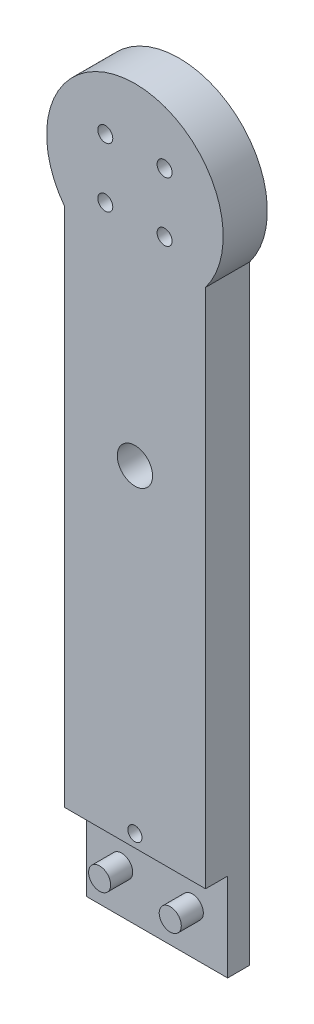
ISO-10303-21;
HEADER;
FILE_DESCRIPTION(('STEP AP214'),'2;1');
FILE_NAME('part.step','',(''),(''),'','','');
FILE_SCHEMA(('AUTOMOTIVE_DESIGN { 1 0 10303 214 1 1 1 1 }'));
ENDSEC;
DATA;
#1=APPLICATION_CONTEXT('core data for automotive mechanical design processes');
#2=APPLICATION_PROTOCOL_DEFINITION('international standard','automotive_design',2000,#1);
#3=PRODUCT_CONTEXT('',#1,'mechanical');
#4=PRODUCT('Part','Part','',(#3));
#5=PRODUCT_RELATED_PRODUCT_CATEGORY('part','',(#4));
#6=PRODUCT_DEFINITION_FORMATION('','',#4);
#7=PRODUCT_DEFINITION_CONTEXT('part definition',#1,'design');
#8=PRODUCT_DEFINITION('design','',#6,#7);
#9=PRODUCT_DEFINITION_SHAPE('','',#8);
#10=(LENGTH_UNIT() NAMED_UNIT(*) SI_UNIT(.MILLI.,.METRE.));
#11=(NAMED_UNIT(*) PLANE_ANGLE_UNIT() SI_UNIT($,.RADIAN.));
#12=(NAMED_UNIT(*) SI_UNIT($,.STERADIAN.) SOLID_ANGLE_UNIT());
#13=UNCERTAINTY_MEASURE_WITH_UNIT(LENGTH_MEASURE(1.E-05),#10,'distance_accuracy_value','');
#14=(GEOMETRIC_REPRESENTATION_CONTEXT(3) GLOBAL_UNCERTAINTY_ASSIGNED_CONTEXT((#13)) GLOBAL_UNIT_ASSIGNED_CONTEXT((#10,
#11,#12)) REPRESENTATION_CONTEXT('',''));
#15=CARTESIAN_POINT('',(0.,0.,0.));
#16=DIRECTION('',(0.,0.,1.));
#17=DIRECTION('',(1.,0.,0.));
#18=AXIS2_PLACEMENT_3D('',#15,#16,#17);
#19=CARTESIAN_POINT('',(0.,130.,10.));
#20=DIRECTION('',(0.,0.,-1.));
#21=DIRECTION('',(-1.,0.,0.));
#22=AXIS2_PLACEMENT_3D('',#19,#20,#21);
#23=CYLINDRICAL_SURFACE('',#22,20.);
#24=CARTESIAN_POINT('',(0.,130.,0.));
#25=DIRECTION('',(0.,0.,1.));
#26=DIRECTION('',(1.,0.,0.));
#27=AXIS2_PLACEMENT_3D('',#24,#25,#26);
#28=CIRCLE('',#27,20.);
#29=CARTESIAN_POINT('',(16.,118.,0.));
#30=VERTEX_POINT('',#29);
#31=CARTESIAN_POINT('',(-16.,118.,0.));
#32=VERTEX_POINT('',#31);
#33=EDGE_CURVE('E107',#30,#32,#28,.T.);
#34=ORIENTED_EDGE('',*,*,#33,.T.);
#35=DIRECTION('',(0.,0.,-1.));
#36=VECTOR('',#35,1.);
#37=CARTESIAN_POINT('',(-16.,118.,10.));
#38=LINE('',#37,#36);
#39=CARTESIAN_POINT('',(-16.,118.,10.));
#40=VERTEX_POINT('',#39);
#41=EDGE_CURVE('E103',#40,#32,#38,.T.);
#42=ORIENTED_EDGE('',*,*,#41,.F.);
#43=CARTESIAN_POINT('',(0.,130.,10.));
#44=DIRECTION('',(0.,0.,1.));
#45=DIRECTION('',(1.,0.,0.));
#46=AXIS2_PLACEMENT_3D('',#43,#44,#45);
#47=CIRCLE('',#46,20.);
#48=CARTESIAN_POINT('',(16.,118.,10.));
#49=VERTEX_POINT('',#48);
#50=EDGE_CURVE('E78',#49,#40,#47,.T.);
#51=ORIENTED_EDGE('',*,*,#50,.F.);
#52=DIRECTION('',(0.,0.,-1.));
#53=VECTOR('',#52,1.);
#54=CARTESIAN_POINT('',(16.,118.,10.));
#55=LINE('',#54,#53);
#56=EDGE_CURVE('E139',#49,#30,#55,.T.);
#57=ORIENTED_EDGE('',*,*,#56,.T.);
#58=EDGE_LOOP('',(#34,#42,#51,#57));
#59=FACE_BOUND('',#58,.T.);
#60=ADVANCED_FACE('F35',(#59),#23,.T.);
#61=CARTESIAN_POINT('',(-16.,0.,10.));
#62=DIRECTION('',(-1.,0.,0.));
#63=DIRECTION('',(0.,0.,1.));
#64=AXIS2_PLACEMENT_3D('',#61,#62,#63);
#65=PLANE('',#64);
#66=DIRECTION('',(0.,1.,0.));
#67=VECTOR('',#66,1.);
#68=CARTESIAN_POINT('',(-16.,0.,0.));
#69=LINE('',#68,#67);
#70=CARTESIAN_POINT('',(-16.,-20.,0.));
#71=VERTEX_POINT('',#70);
#72=EDGE_CURVE('E96',#71,#32,#69,.T.);
#73=ORIENTED_EDGE('',*,*,#72,.F.);
#74=DIRECTION('',(0.,0.,-1.));
#75=VECTOR('',#74,1.);
#76=CARTESIAN_POINT('',(-16.,-20.,5.));
#77=LINE('',#76,#75);
#78=CARTESIAN_POINT('',(-16.,-20.,5.));
#79=VERTEX_POINT('',#78);
#80=EDGE_CURVE('E101',#79,#71,#77,.T.);
#81=ORIENTED_EDGE('',*,*,#80,.F.);
#82=DIRECTION('',(0.,1.,0.));
#83=VECTOR('',#82,1.);
#84=CARTESIAN_POINT('',(-16.,-20.,5.));
#85=LINE('',#84,#83);
#86=CARTESIAN_POINT('',(-16.,0.,5.));
#87=VERTEX_POINT('',#86);
#88=EDGE_CURVE('E126',#79,#87,#85,.T.);
#89=ORIENTED_EDGE('',*,*,#88,.T.);
#90=DIRECTION('',(0.,0.,-1.));
#91=VECTOR('',#90,1.);
#92=CARTESIAN_POINT('',(-16.,0.,10.));
#93=LINE('',#92,#91);
#94=CARTESIAN_POINT('',(-16.,0.,10.));
#95=VERTEX_POINT('',#94);
#96=EDGE_CURVE('E145',#95,#87,#93,.T.);
#97=ORIENTED_EDGE('',*,*,#96,.F.);
#98=DIRECTION('',(0.,1.,0.));
#99=VECTOR('',#98,1.);
#100=CARTESIAN_POINT('',(-16.,0.,10.));
#101=LINE('',#100,#99);
#102=EDGE_CURVE('E133',#95,#40,#101,.T.);
#103=ORIENTED_EDGE('',*,*,#102,.T.);
#104=ORIENTED_EDGE('',*,*,#41,.T.);
#105=EDGE_LOOP('',(#73,#81,#89,#97,#103,#104));
#106=FACE_BOUND('',#105,.T.);
#107=ADVANCED_FACE('F98',(#106),#65,.T.);
#108=CARTESIAN_POINT('',(0.,0.,10.));
#109=DIRECTION('',(0.,-1.,0.));
#110=DIRECTION('',(0.,0.,-1.));
#111=AXIS2_PLACEMENT_3D('',#108,#109,#110);
#112=PLANE('',#111);
#113=DIRECTION('',(-1.,0.,0.));
#114=VECTOR('',#113,1.);
#115=CARTESIAN_POINT('',(-16.,0.,5.));
#116=LINE('',#115,#114);
#117=CARTESIAN_POINT('',(16.,0.,5.));
#118=VERTEX_POINT('',#117);
#119=EDGE_CURVE('E49',#118,#87,#116,.T.);
#120=ORIENTED_EDGE('',*,*,#119,.F.);
#121=DIRECTION('',(0.,0.,-1.));
#122=VECTOR('',#121,1.);
#123=CARTESIAN_POINT('',(16.,0.,10.));
#124=LINE('',#123,#122);
#125=CARTESIAN_POINT('',(16.,0.,10.));
#126=VERTEX_POINT('',#125);
#127=EDGE_CURVE('E143',#126,#118,#124,.T.);
#128=ORIENTED_EDGE('',*,*,#127,.F.);
#129=DIRECTION('',(-1.,0.,0.));
#130=VECTOR('',#129,1.);
#131=CARTESIAN_POINT('',(0.,0.,10.));
#132=LINE('',#131,#130);
#133=EDGE_CURVE('E135',#126,#95,#132,.T.);
#134=ORIENTED_EDGE('',*,*,#133,.T.);
#135=ORIENTED_EDGE('',*,*,#96,.T.);
#136=EDGE_LOOP('',(#120,#128,#134,#135));
#137=FACE_BOUND('',#136,.T.);
#138=ADVANCED_FACE('F159',(#137),#112,.T.);
#139=CARTESIAN_POINT('',(16.,0.,10.));
#140=DIRECTION('',(-1.,0.,0.));
#141=DIRECTION('',(0.,0.,1.));
#142=AXIS2_PLACEMENT_3D('',#139,#140,#141);
#143=PLANE('',#142);
#144=DIRECTION('',(0.,1.,0.));
#145=VECTOR('',#144,1.);
#146=CARTESIAN_POINT('',(16.,0.,0.));
#147=LINE('',#146,#145);
#148=CARTESIAN_POINT('',(16.,-20.,0.));
#149=VERTEX_POINT('',#148);
#150=EDGE_CURVE('E73',#149,#30,#147,.T.);
#151=ORIENTED_EDGE('',*,*,#150,.T.);
#152=ORIENTED_EDGE('',*,*,#56,.F.);
#153=DIRECTION('',(0.,1.,0.));
#154=VECTOR('',#153,1.);
#155=CARTESIAN_POINT('',(16.,0.,10.));
#156=LINE('',#155,#154);
#157=EDGE_CURVE('E58',#126,#49,#156,.T.);
#158=ORIENTED_EDGE('',*,*,#157,.F.);
#159=ORIENTED_EDGE('',*,*,#127,.T.);
#160=DIRECTION('',(0.,1.,0.));
#161=VECTOR('',#160,1.);
#162=CARTESIAN_POINT('',(16.,-20.,5.));
#163=LINE('',#162,#161);
#164=CARTESIAN_POINT('',(16.,-20.,5.));
#165=VERTEX_POINT('',#164);
#166=EDGE_CURVE('E129',#165,#118,#163,.T.);
#167=ORIENTED_EDGE('',*,*,#166,.F.);
#168=DIRECTION('',(0.,0.,1.));
#169=VECTOR('',#168,1.);
#170=CARTESIAN_POINT('',(16.,-20.,5.));
#171=LINE('',#170,#169);
#172=EDGE_CURVE('E113',#149,#165,#171,.T.);
#173=ORIENTED_EDGE('',*,*,#172,.F.);
#174=EDGE_LOOP('',(#151,#152,#158,#159,#167,#173));
#175=FACE_BOUND('',#174,.T.);
#176=ADVANCED_FACE('F160',(#175),#143,.F.);
#177=CARTESIAN_POINT('',(0.,0.,10.));
#178=DIRECTION('',(0.,0.,1.));
#179=DIRECTION('',(1.,0.,0.));
#180=AXIS2_PLACEMENT_3D('',#177,#178,#179);
#181=PLANE('',#180);
#182=CARTESIAN_POINT('',(0.,2.83,10.));
#183=DIRECTION('',(0.,0.,1.));
#184=DIRECTION('',(1.,0.,0.));
#185=AXIS2_PLACEMENT_3D('',#182,#183,#184);
#186=CIRCLE('',#185,1.6);
#187=CARTESIAN_POINT('',(1.6,2.83,10.));
#188=VERTEX_POINT('',#187);
#189=EDGE_CURVE('E254',#188,#188,#186,.T.);
#190=ORIENTED_EDGE('',*,*,#189,.F.);
#191=EDGE_LOOP('',(#190));
#192=FACE_BOUND('',#191,.T.);
#193=CARTESIAN_POINT('',(0.,75.,10.));
#194=DIRECTION('',(0.,0.,1.));
#195=DIRECTION('',(1.,0.,0.));
#196=AXIS2_PLACEMENT_3D('',#193,#194,#195);
#197=CIRCLE('',#196,4.);
#198=CARTESIAN_POINT('',(4.,75.,10.));
#199=VERTEX_POINT('',#198);
#200=EDGE_CURVE('E248',#199,#199,#197,.T.);
#201=ORIENTED_EDGE('',*,*,#200,.F.);
#202=EDGE_LOOP('',(#201));
#203=FACE_BOUND('',#202,.T.);
#204=CARTESIAN_POINT('',(-6.71751442127216,123.282485578728,10.));
#205=DIRECTION('',(0.,0.,1.));
#206=DIRECTION('',(1.,0.,0.));
#207=AXIS2_PLACEMENT_3D('',#204,#205,#206);
#208=CIRCLE('',#207,1.7);
#209=CARTESIAN_POINT('',(-5.01751442127216,123.282485578728,10.));
#210=VERTEX_POINT('',#209);
#211=EDGE_CURVE('E242',#210,#210,#208,.T.);
#212=ORIENTED_EDGE('',*,*,#211,.F.);
#213=EDGE_LOOP('',(#212));
#214=FACE_BOUND('',#213,.T.);
#215=CARTESIAN_POINT('',(6.71751442127231,123.282485578728,10.));
#216=DIRECTION('',(0.,0.,1.));
#217=DIRECTION('',(1.,0.,0.));
#218=AXIS2_PLACEMENT_3D('',#215,#216,#217);
#219=CIRCLE('',#218,1.7);
#220=CARTESIAN_POINT('',(8.41751442127231,123.282485578728,10.));
#221=VERTEX_POINT('',#220);
#222=EDGE_CURVE('E234',#221,#221,#219,.T.);
#223=ORIENTED_EDGE('',*,*,#222,.F.);
#224=EDGE_LOOP('',(#223));
#225=FACE_BOUND('',#224,.T.);
#226=CARTESIAN_POINT('',(6.71751442127228,136.717514421272,10.));
#227=DIRECTION('',(0.,0.,1.));
#228=DIRECTION('',(1.,0.,0.));
#229=AXIS2_PLACEMENT_3D('',#226,#227,#228);
#230=CIRCLE('',#229,1.7);
#231=CARTESIAN_POINT('',(8.41751442127228,136.717514421272,10.));
#232=VERTEX_POINT('',#231);
#233=EDGE_CURVE('E227',#232,#232,#230,.T.);
#234=ORIENTED_EDGE('',*,*,#233,.F.);
#235=EDGE_LOOP('',(#234));
#236=FACE_BOUND('',#235,.T.);
#237=CARTESIAN_POINT('',(-6.71751442127217,136.717514421272,10.));
#238=DIRECTION('',(0.,0.,1.));
#239=DIRECTION('',(1.,0.,0.));
#240=AXIS2_PLACEMENT_3D('',#237,#238,#239);
#241=CIRCLE('',#240,1.70000000000001);
#242=CARTESIAN_POINT('',(-5.01751442127216,136.717514421272,10.));
#243=VERTEX_POINT('',#242);
#244=EDGE_CURVE('E231',#243,#243,#241,.T.);
#245=ORIENTED_EDGE('',*,*,#244,.F.);
#246=EDGE_LOOP('',(#245));
#247=FACE_BOUND('',#246,.T.);
#248=ORIENTED_EDGE('',*,*,#50,.T.);
#249=ORIENTED_EDGE('',*,*,#102,.F.);
#250=ORIENTED_EDGE('',*,*,#133,.F.);
#251=ORIENTED_EDGE('',*,*,#157,.T.);
#252=EDGE_LOOP('',(#248,#249,#250,#251));
#253=FACE_BOUND('',#252,.T.);
#254=ADVANCED_FACE('F158',(#192,#203,#214,#225,#236,#247,#253),#181,.T.);
#255=CARTESIAN_POINT('',(0.,0.,0.));
#256=DIRECTION('',(0.,0.,1.));
#257=DIRECTION('',(1.,0.,0.));
#258=AXIS2_PLACEMENT_3D('',#255,#256,#257);
#259=PLANE('',#258);
#260=CARTESIAN_POINT('',(0.,2.83,0.));
#261=DIRECTION('',(0.,0.,1.));
#262=DIRECTION('',(1.,0.,0.));
#263=AXIS2_PLACEMENT_3D('',#260,#261,#262);
#264=CIRCLE('',#263,1.6);
#265=CARTESIAN_POINT('',(1.6,2.83,0.));
#266=VERTEX_POINT('',#265);
#267=EDGE_CURVE('E251',#266,#266,#264,.T.);
#268=ORIENTED_EDGE('',*,*,#267,.T.);
#269=EDGE_LOOP('',(#268));
#270=FACE_BOUND('',#269,.T.);
#271=CARTESIAN_POINT('',(0.,75.,0.));
#272=DIRECTION('',(0.,0.,1.));
#273=DIRECTION('',(1.,0.,0.));
#274=AXIS2_PLACEMENT_3D('',#271,#272,#273);
#275=CIRCLE('',#274,4.);
#276=CARTESIAN_POINT('',(4.,75.,0.));
#277=VERTEX_POINT('',#276);
#278=EDGE_CURVE('E245',#277,#277,#275,.T.);
#279=ORIENTED_EDGE('',*,*,#278,.T.);
#280=EDGE_LOOP('',(#279));
#281=FACE_BOUND('',#280,.T.);
#282=CARTESIAN_POINT('',(-6.71751442127216,123.282485578728,0.));
#283=DIRECTION('',(0.,0.,1.));
#284=DIRECTION('',(1.,0.,0.));
#285=AXIS2_PLACEMENT_3D('',#282,#283,#284);
#286=CIRCLE('',#285,1.7);
#287=CARTESIAN_POINT('',(-5.01751442127216,123.282485578728,0.));
#288=VERTEX_POINT('',#287);
#289=EDGE_CURVE('E239',#288,#288,#286,.T.);
#290=ORIENTED_EDGE('',*,*,#289,.T.);
#291=EDGE_LOOP('',(#290));
#292=FACE_BOUND('',#291,.T.);
#293=CARTESIAN_POINT('',(6.71751442127231,123.282485578728,0.));
#294=DIRECTION('',(0.,0.,1.));
#295=DIRECTION('',(1.,0.,0.));
#296=AXIS2_PLACEMENT_3D('',#293,#294,#295);
#297=CIRCLE('',#296,1.7);
#298=CARTESIAN_POINT('',(8.41751442127231,123.282485578728,0.));
#299=VERTEX_POINT('',#298);
#300=EDGE_CURVE('E229',#299,#299,#297,.T.);
#301=ORIENTED_EDGE('',*,*,#300,.T.);
#302=EDGE_LOOP('',(#301));
#303=FACE_BOUND('',#302,.T.);
#304=CARTESIAN_POINT('',(6.71751442127228,136.717514421272,0.));
#305=DIRECTION('',(0.,0.,1.));
#306=DIRECTION('',(1.,0.,0.));
#307=AXIS2_PLACEMENT_3D('',#304,#305,#306);
#308=CIRCLE('',#307,1.7);
#309=CARTESIAN_POINT('',(8.41751442127228,136.717514421272,0.));
#310=VERTEX_POINT('',#309);
#311=EDGE_CURVE('E224',#310,#310,#308,.T.);
#312=ORIENTED_EDGE('',*,*,#311,.T.);
#313=EDGE_LOOP('',(#312));
#314=FACE_BOUND('',#313,.T.);
#315=CARTESIAN_POINT('',(-6.71751442127217,136.717514421272,0.));
#316=DIRECTION('',(0.,0.,1.));
#317=DIRECTION('',(1.,0.,0.));
#318=AXIS2_PLACEMENT_3D('',#315,#316,#317);
#319=CIRCLE('',#318,1.70000000000001);
#320=CARTESIAN_POINT('',(-5.01751442127216,136.717514421272,0.));
#321=VERTEX_POINT('',#320);
#322=EDGE_CURVE('E257',#321,#321,#319,.T.);
#323=ORIENTED_EDGE('',*,*,#322,.T.);
#324=EDGE_LOOP('',(#323));
#325=FACE_BOUND('',#324,.T.);
#326=ORIENTED_EDGE('',*,*,#33,.F.);
#327=ORIENTED_EDGE('',*,*,#150,.F.);
#328=DIRECTION('',(1.,0.,0.));
#329=VECTOR('',#328,1.);
#330=CARTESIAN_POINT('',(-16.,-20.,0.));
#331=LINE('',#330,#329);
#332=EDGE_CURVE('E110',#71,#149,#331,.T.);
#333=ORIENTED_EDGE('',*,*,#332,.F.);
#334=ORIENTED_EDGE('',*,*,#72,.T.);
#335=EDGE_LOOP('',(#326,#327,#333,#334));
#336=FACE_BOUND('',#335,.T.);
#337=ADVANCED_FACE('F111',(#270,#281,#292,#303,#314,#325,#336),#259,.F.);
#338=CARTESIAN_POINT('',(-16.,-20.,5.));
#339=DIRECTION('',(0.,0.,-1.));
#340=DIRECTION('',(-1.,0.,0.));
#341=AXIS2_PLACEMENT_3D('',#338,#339,#340);
#342=PLANE('',#341);
#343=CARTESIAN_POINT('',(8.,-10.,5.));
#344=DIRECTION('',(0.,0.,-1.));
#345=DIRECTION('',(-1.,0.,0.));
#346=AXIS2_PLACEMENT_3D('',#343,#344,#345);
#347=CIRCLE('',#346,2.5);
#348=CARTESIAN_POINT('',(5.5,-10.,5.));
#349=VERTEX_POINT('',#348);
#350=EDGE_CURVE('E11',#349,#349,#347,.F.);
#351=ORIENTED_EDGE('',*,*,#350,.F.);
#352=EDGE_LOOP('',(#351));
#353=FACE_BOUND('',#352,.T.);
#354=CARTESIAN_POINT('',(-8.,-10.,5.));
#355=DIRECTION('',(0.,0.,-1.));
#356=DIRECTION('',(-1.,0.,0.));
#357=AXIS2_PLACEMENT_3D('',#354,#355,#356);
#358=CIRCLE('',#357,2.5);
#359=CARTESIAN_POINT('',(-10.5,-10.,5.));
#360=VERTEX_POINT('',#359);
#361=EDGE_CURVE('E42',#360,#360,#358,.F.);
#362=ORIENTED_EDGE('',*,*,#361,.F.);
#363=EDGE_LOOP('',(#362));
#364=FACE_BOUND('',#363,.T.);
#365=ORIENTED_EDGE('',*,*,#119,.T.);
#366=ORIENTED_EDGE('',*,*,#88,.F.);
#367=DIRECTION('',(-1.,0.,0.));
#368=VECTOR('',#367,1.);
#369=CARTESIAN_POINT('',(-16.,-20.,5.));
#370=LINE('',#369,#368);
#371=EDGE_CURVE('E117',#165,#79,#370,.T.);
#372=ORIENTED_EDGE('',*,*,#371,.F.);
#373=ORIENTED_EDGE('',*,*,#166,.T.);
#374=EDGE_LOOP('',(#365,#366,#372,#373));
#375=FACE_BOUND('',#374,.T.);
#376=ADVANCED_FACE('F152',(#353,#364,#375),#342,.F.);
#377=CARTESIAN_POINT('',(0.,-20.,0.));
#378=DIRECTION('',(0.,-1.,0.));
#379=DIRECTION('',(0.,0.,-1.));
#380=AXIS2_PLACEMENT_3D('',#377,#378,#379);
#381=PLANE('',#380);
#382=ORIENTED_EDGE('',*,*,#80,.T.);
#383=ORIENTED_EDGE('',*,*,#332,.T.);
#384=ORIENTED_EDGE('',*,*,#172,.T.);
#385=ORIENTED_EDGE('',*,*,#371,.T.);
#386=EDGE_LOOP('',(#382,#383,#384,#385));
#387=FACE_BOUND('',#386,.T.);
#388=ADVANCED_FACE('F115',(#387),#381,.T.);
#389=CARTESIAN_POINT('',(-8.,-10.,10.));
#390=DIRECTION('',(0.,0.,-1.));
#391=DIRECTION('',(-1.,0.,0.));
#392=AXIS2_PLACEMENT_3D('',#389,#390,#391);
#393=CYLINDRICAL_SURFACE('',#392,2.5);
#394=CARTESIAN_POINT('',(-8.,-10.,10.));
#395=DIRECTION('',(0.,0.,1.));
#396=DIRECTION('',(1.,0.,0.));
#397=AXIS2_PLACEMENT_3D('',#394,#395,#396);
#398=CIRCLE('',#397,2.5);
#399=CARTESIAN_POINT('',(-5.5,-10.,10.));
#400=VERTEX_POINT('',#399);
#401=EDGE_CURVE('E120',#400,#400,#398,.T.);
#402=ORIENTED_EDGE('',*,*,#401,.F.);
#403=EDGE_LOOP('',(#402));
#404=FACE_BOUND('',#403,.T.);
#405=ORIENTED_EDGE('',*,*,#361,.T.);
#406=EDGE_LOOP('',(#405));
#407=FACE_BOUND('',#406,.T.);
#408=ADVANCED_FACE('F150',(#404,#407),#393,.T.);
#409=CARTESIAN_POINT('',(-8.,-10.,10.));
#410=DIRECTION('',(0.,0.,1.));
#411=DIRECTION('',(1.,0.,0.));
#412=AXIS2_PLACEMENT_3D('',#409,#410,#411);
#413=PLANE('',#412);
#414=ORIENTED_EDGE('',*,*,#401,.T.);
#415=EDGE_LOOP('',(#414));
#416=FACE_BOUND('',#415,.T.);
#417=ADVANCED_FACE('F183',(#416),#413,.T.);
#418=CARTESIAN_POINT('',(8.,-10.,10.));
#419=DIRECTION('',(0.,0.,-1.));
#420=DIRECTION('',(-1.,0.,0.));
#421=AXIS2_PLACEMENT_3D('',#418,#419,#420);
#422=CYLINDRICAL_SURFACE('',#421,2.5);
#423=CARTESIAN_POINT('',(8.,-10.,10.));
#424=DIRECTION('',(0.,0.,1.));
#425=DIRECTION('',(-1.,0.,0.));
#426=AXIS2_PLACEMENT_3D('',#423,#424,#425);
#427=CIRCLE('',#426,2.5);
#428=CARTESIAN_POINT('',(5.5,-10.,10.));
#429=VERTEX_POINT('',#428);
#430=EDGE_CURVE('E260',#429,#429,#427,.T.);
#431=ORIENTED_EDGE('',*,*,#430,.F.);
#432=EDGE_LOOP('',(#431));
#433=FACE_BOUND('',#432,.T.);
#434=ORIENTED_EDGE('',*,*,#350,.T.);
#435=EDGE_LOOP('',(#434));
#436=FACE_BOUND('',#435,.T.);
#437=ADVANCED_FACE('F187',(#433,#436),#422,.T.);
#438=CARTESIAN_POINT('',(8.,-10.,10.));
#439=DIRECTION('',(0.,0.,-1.));
#440=DIRECTION('',(-1.,0.,0.));
#441=AXIS2_PLACEMENT_3D('',#438,#439,#440);
#442=PLANE('',#441);
#443=ORIENTED_EDGE('',*,*,#430,.T.);
#444=EDGE_LOOP('',(#443));
#445=FACE_BOUND('',#444,.T.);
#446=ADVANCED_FACE('F191',(#445),#442,.F.);
#447=CARTESIAN_POINT('',(-6.71751442127217,136.717514421272,0.));
#448=DIRECTION('',(0.,0.,1.));
#449=DIRECTION('',(1.,0.,0.));
#450=AXIS2_PLACEMENT_3D('',#447,#448,#449);
#451=CYLINDRICAL_SURFACE('',#450,1.70000000000001);
#452=ORIENTED_EDGE('',*,*,#322,.F.);
#453=EDGE_LOOP('',(#452));
#454=FACE_BOUND('',#453,.T.);
#455=ORIENTED_EDGE('',*,*,#244,.T.);
#456=EDGE_LOOP('',(#455));
#457=FACE_BOUND('',#456,.T.);
#458=ADVANCED_FACE('F195',(#454,#457),#451,.F.);
#459=CARTESIAN_POINT('',(6.71751442127228,136.717514421272,0.));
#460=DIRECTION('',(0.,0.,1.));
#461=DIRECTION('',(1.,0.,0.));
#462=AXIS2_PLACEMENT_3D('',#459,#460,#461);
#463=CYLINDRICAL_SURFACE('',#462,1.7);
#464=ORIENTED_EDGE('',*,*,#311,.F.);
#465=EDGE_LOOP('',(#464));
#466=FACE_BOUND('',#465,.T.);
#467=ORIENTED_EDGE('',*,*,#233,.T.);
#468=EDGE_LOOP('',(#467));
#469=FACE_BOUND('',#468,.T.);
#470=ADVANCED_FACE('F199',(#466,#469),#463,.F.);
#471=CARTESIAN_POINT('',(6.71751442127231,123.282485578728,0.));
#472=DIRECTION('',(0.,0.,1.));
#473=DIRECTION('',(1.,0.,0.));
#474=AXIS2_PLACEMENT_3D('',#471,#472,#473);
#475=CYLINDRICAL_SURFACE('',#474,1.7);
#476=ORIENTED_EDGE('',*,*,#300,.F.);
#477=EDGE_LOOP('',(#476));
#478=FACE_BOUND('',#477,.T.);
#479=ORIENTED_EDGE('',*,*,#222,.T.);
#480=EDGE_LOOP('',(#479));
#481=FACE_BOUND('',#480,.T.);
#482=ADVANCED_FACE('F212',(#478,#481),#475,.F.);
#483=CARTESIAN_POINT('',(-6.71751442127216,123.282485578728,0.));
#484=DIRECTION('',(0.,0.,1.));
#485=DIRECTION('',(1.,0.,0.));
#486=AXIS2_PLACEMENT_3D('',#483,#484,#485);
#487=CYLINDRICAL_SURFACE('',#486,1.7);
#488=ORIENTED_EDGE('',*,*,#289,.F.);
#489=EDGE_LOOP('',(#488));
#490=FACE_BOUND('',#489,.T.);
#491=ORIENTED_EDGE('',*,*,#211,.T.);
#492=EDGE_LOOP('',(#491));
#493=FACE_BOUND('',#492,.T.);
#494=ADVANCED_FACE('F208',(#490,#493),#487,.F.);
#495=CARTESIAN_POINT('',(0.,75.,0.));
#496=DIRECTION('',(0.,0.,1.));
#497=DIRECTION('',(1.,0.,0.));
#498=AXIS2_PLACEMENT_3D('',#495,#496,#497);
#499=CYLINDRICAL_SURFACE('',#498,4.);
#500=ORIENTED_EDGE('',*,*,#278,.F.);
#501=EDGE_LOOP('',(#500));
#502=FACE_BOUND('',#501,.T.);
#503=ORIENTED_EDGE('',*,*,#200,.T.);
#504=EDGE_LOOP('',(#503));
#505=FACE_BOUND('',#504,.T.);
#506=ADVANCED_FACE('F204',(#502,#505),#499,.F.);
#507=CARTESIAN_POINT('',(0.,2.83,0.));
#508=DIRECTION('',(0.,0.,1.));
#509=DIRECTION('',(1.,0.,0.));
#510=AXIS2_PLACEMENT_3D('',#507,#508,#509);
#511=CYLINDRICAL_SURFACE('',#510,1.6);
#512=ORIENTED_EDGE('',*,*,#267,.F.);
#513=EDGE_LOOP('',(#512));
#514=FACE_BOUND('',#513,.T.);
#515=ORIENTED_EDGE('',*,*,#189,.T.);
#516=EDGE_LOOP('',(#515));
#517=FACE_BOUND('',#516,.T.);
#518=ADVANCED_FACE('F201',(#514,#517),#511,.F.);
#519=CLOSED_SHELL('',(#60,#107,#138,#176,#254,#337,#376,#388,#408,#417,#437,#446,#458,#470,#482,
#494,#506,#518));
#520=MANIFOLD_SOLID_BREP('B2',#519);
#521=ADVANCED_BREP_SHAPE_REPRESENTATION('',(#18,#520),#14);
#522=SHAPE_DEFINITION_REPRESENTATION(#9,#521);
ENDSEC;
END-ISO-10303-21;
